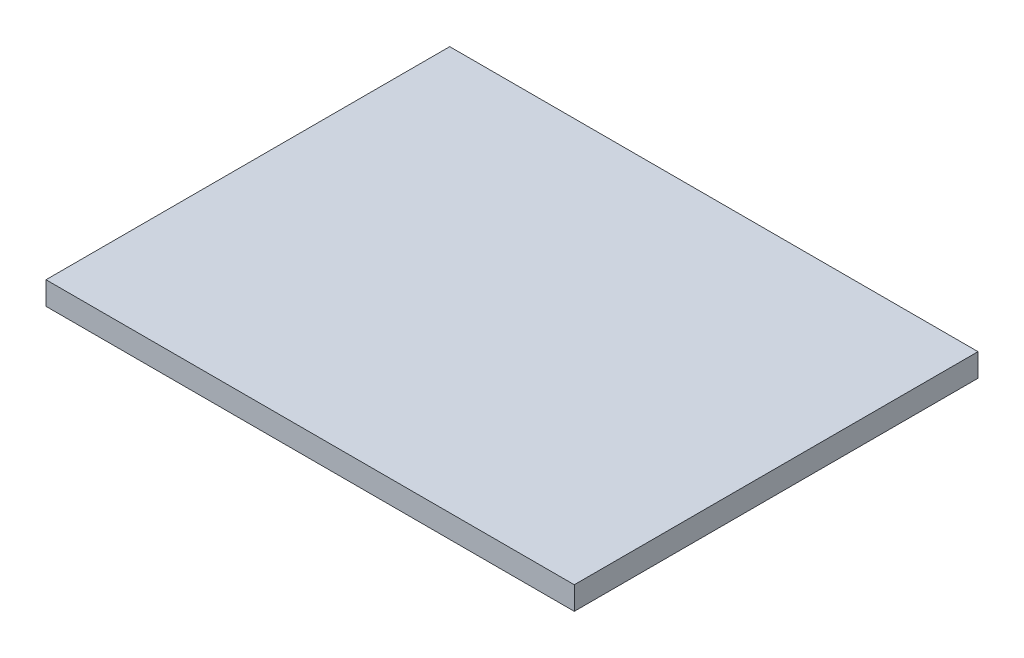
ISO-10303-21;
HEADER;
FILE_DESCRIPTION(('STEP AP214'),'2;1');
FILE_NAME('part.step','',(''),(''),'','','');
FILE_SCHEMA(('AUTOMOTIVE_DESIGN { 1 0 10303 214 1 1 1 1 }'));
ENDSEC;
DATA;
#1=APPLICATION_CONTEXT('core data for automotive mechanical design processes');
#2=APPLICATION_PROTOCOL_DEFINITION('international standard','automotive_design',2000,#1);
#3=PRODUCT_CONTEXT('',#1,'mechanical');
#4=PRODUCT('Part','Part','',(#3));
#5=PRODUCT_RELATED_PRODUCT_CATEGORY('part','',(#4));
#6=PRODUCT_DEFINITION_FORMATION('','',#4);
#7=PRODUCT_DEFINITION_CONTEXT('part definition',#1,'design');
#8=PRODUCT_DEFINITION('design','',#6,#7);
#9=PRODUCT_DEFINITION_SHAPE('','',#8);
#10=(LENGTH_UNIT() NAMED_UNIT(*) SI_UNIT(.MILLI.,.METRE.));
#11=(NAMED_UNIT(*) PLANE_ANGLE_UNIT() SI_UNIT($,.RADIAN.));
#12=(NAMED_UNIT(*) SI_UNIT($,.STERADIAN.) SOLID_ANGLE_UNIT());
#13=UNCERTAINTY_MEASURE_WITH_UNIT(LENGTH_MEASURE(1.E-05),#10,'distance_accuracy_value','');
#14=(GEOMETRIC_REPRESENTATION_CONTEXT(3) GLOBAL_UNCERTAINTY_ASSIGNED_CONTEXT((#13)) GLOBAL_UNIT_ASSIGNED_CONTEXT((#10,
#11,#12)) REPRESENTATION_CONTEXT('',''));
#15=CARTESIAN_POINT('',(0.,0.,0.));
#16=DIRECTION('',(0.,0.,1.));
#17=DIRECTION('',(1.,0.,0.));
#18=AXIS2_PLACEMENT_3D('',#15,#16,#17);
#19=CARTESIAN_POINT('',(0.,10.,0.));
#20=DIRECTION('',(1.,0.,0.));
#21=DIRECTION('',(0.,0.,-1.));
#22=AXIS2_PLACEMENT_3D('',#19,#20,#21);
#23=PLANE('',#22);
#24=DIRECTION('',(0.,0.,1.));
#25=VECTOR('',#24,1.);
#26=CARTESIAN_POINT('',(0.,0.,0.));
#27=LINE('',#26,#25);
#28=CARTESIAN_POINT('',(0.,0.,-175.));
#29=VERTEX_POINT('',#28);
#30=CARTESIAN_POINT('',(0.,0.,0.));
#31=VERTEX_POINT('',#30);
#32=EDGE_CURVE('E99',#29,#31,#27,.T.);
#33=ORIENTED_EDGE('',*,*,#32,.T.);
#34=DIRECTION('',(0.,-1.,0.));
#35=VECTOR('',#34,1.);
#36=CARTESIAN_POINT('',(0.,10.,0.));
#37=LINE('',#36,#35);
#38=CARTESIAN_POINT('',(0.,10.,0.));
#39=VERTEX_POINT('',#38);
#40=EDGE_CURVE('E11',#39,#31,#37,.T.);
#41=ORIENTED_EDGE('',*,*,#40,.F.);
#42=DIRECTION('',(0.,0.,1.));
#43=VECTOR('',#42,1.);
#44=CARTESIAN_POINT('',(0.,10.,0.));
#45=LINE('',#44,#43);
#46=CARTESIAN_POINT('',(0.,10.,-175.));
#47=VERTEX_POINT('',#46);
#48=EDGE_CURVE('E87',#47,#39,#45,.T.);
#49=ORIENTED_EDGE('',*,*,#48,.F.);
#50=DIRECTION('',(0.,-1.,0.));
#51=VECTOR('',#50,1.);
#52=CARTESIAN_POINT('',(0.,10.,-175.));
#53=LINE('',#52,#51);
#54=EDGE_CURVE('E95',#47,#29,#53,.T.);
#55=ORIENTED_EDGE('',*,*,#54,.T.);
#56=EDGE_LOOP('',(#33,#41,#49,#55));
#57=FACE_BOUND('',#56,.T.);
#58=ADVANCED_FACE('F36',(#57),#23,.F.);
#59=CARTESIAN_POINT('',(0.,10.,0.));
#60=DIRECTION('',(0.,0.,-1.));
#61=DIRECTION('',(-1.,0.,0.));
#62=AXIS2_PLACEMENT_3D('',#59,#60,#61);
#63=PLANE('',#62);
#64=DIRECTION('',(1.,0.,0.));
#65=VECTOR('',#64,1.);
#66=CARTESIAN_POINT('',(0.,0.,0.));
#67=LINE('',#66,#65);
#68=CARTESIAN_POINT('',(229.,0.,0.));
#69=VERTEX_POINT('',#68);
#70=EDGE_CURVE('E91',#31,#69,#67,.T.);
#71=ORIENTED_EDGE('',*,*,#70,.T.);
#72=DIRECTION('',(0.,-1.,0.));
#73=VECTOR('',#72,1.);
#74=CARTESIAN_POINT('',(229.,10.,0.));
#75=LINE('',#74,#73);
#76=CARTESIAN_POINT('',(229.,10.,0.));
#77=VERTEX_POINT('',#76);
#78=EDGE_CURVE('E44',#77,#69,#75,.T.);
#79=ORIENTED_EDGE('',*,*,#78,.F.);
#80=DIRECTION('',(1.,0.,0.));
#81=VECTOR('',#80,1.);
#82=CARTESIAN_POINT('',(0.,10.,0.));
#83=LINE('',#82,#81);
#84=EDGE_CURVE('E82',#39,#77,#83,.T.);
#85=ORIENTED_EDGE('',*,*,#84,.F.);
#86=ORIENTED_EDGE('',*,*,#40,.T.);
#87=EDGE_LOOP('',(#71,#79,#85,#86));
#88=FACE_BOUND('',#87,.T.);
#89=ADVANCED_FACE('F90',(#88),#63,.F.);
#90=CARTESIAN_POINT('',(229.,10.,0.));
#91=DIRECTION('',(-1.,0.,0.));
#92=DIRECTION('',(0.,0.,1.));
#93=AXIS2_PLACEMENT_3D('',#90,#91,#92);
#94=PLANE('',#93);
#95=DIRECTION('',(0.,0.,-1.));
#96=VECTOR('',#95,1.);
#97=CARTESIAN_POINT('',(229.,0.,0.));
#98=LINE('',#97,#96);
#99=CARTESIAN_POINT('',(229.,0.,-175.));
#100=VERTEX_POINT('',#99);
#101=EDGE_CURVE('E69',#69,#100,#98,.T.);
#102=ORIENTED_EDGE('',*,*,#101,.T.);
#103=DIRECTION('',(0.,-1.,0.));
#104=VECTOR('',#103,1.);
#105=CARTESIAN_POINT('',(229.,10.,-175.));
#106=LINE('',#105,#104);
#107=CARTESIAN_POINT('',(229.,10.,-175.));
#108=VERTEX_POINT('',#107);
#109=EDGE_CURVE('E92',#108,#100,#106,.T.);
#110=ORIENTED_EDGE('',*,*,#109,.F.);
#111=DIRECTION('',(0.,0.,-1.));
#112=VECTOR('',#111,1.);
#113=CARTESIAN_POINT('',(229.,10.,0.));
#114=LINE('',#113,#112);
#115=EDGE_CURVE('E85',#77,#108,#114,.T.);
#116=ORIENTED_EDGE('',*,*,#115,.F.);
#117=ORIENTED_EDGE('',*,*,#78,.T.);
#118=EDGE_LOOP('',(#102,#110,#116,#117));
#119=FACE_BOUND('',#118,.T.);
#120=ADVANCED_FACE('F93',(#119),#94,.F.);
#121=CARTESIAN_POINT('',(0.,10.,-175.));
#122=DIRECTION('',(0.,0.,1.));
#123=DIRECTION('',(1.,0.,0.));
#124=AXIS2_PLACEMENT_3D('',#121,#122,#123);
#125=PLANE('',#124);
#126=DIRECTION('',(-1.,0.,0.));
#127=VECTOR('',#126,1.);
#128=CARTESIAN_POINT('',(0.,0.,-175.));
#129=LINE('',#128,#127);
#130=EDGE_CURVE('E75',#100,#29,#129,.T.);
#131=ORIENTED_EDGE('',*,*,#130,.T.);
#132=ORIENTED_EDGE('',*,*,#54,.F.);
#133=DIRECTION('',(-1.,0.,0.));
#134=VECTOR('',#133,1.);
#135=CARTESIAN_POINT('',(0.,10.,-175.));
#136=LINE('',#135,#134);
#137=EDGE_CURVE('E52',#108,#47,#136,.T.);
#138=ORIENTED_EDGE('',*,*,#137,.F.);
#139=ORIENTED_EDGE('',*,*,#109,.T.);
#140=EDGE_LOOP('',(#131,#132,#138,#139));
#141=FACE_BOUND('',#140,.T.);
#142=ADVANCED_FACE('F106',(#141),#125,.F.);
#143=CARTESIAN_POINT('',(0.,10.,0.));
#144=DIRECTION('',(0.,-1.,0.));
#145=DIRECTION('',(0.,0.,-1.));
#146=AXIS2_PLACEMENT_3D('',#143,#144,#145);
#147=PLANE('',#146);
#148=ORIENTED_EDGE('',*,*,#48,.T.);
#149=ORIENTED_EDGE('',*,*,#84,.T.);
#150=ORIENTED_EDGE('',*,*,#115,.T.);
#151=ORIENTED_EDGE('',*,*,#137,.T.);
#152=EDGE_LOOP('',(#148,#149,#150,#151));
#153=FACE_BOUND('',#152,.T.);
#154=ADVANCED_FACE('F83',(#153),#147,.F.);
#155=CARTESIAN_POINT('',(0.,0.,0.));
#156=DIRECTION('',(0.,-1.,0.));
#157=DIRECTION('',(0.,0.,-1.));
#158=AXIS2_PLACEMENT_3D('',#155,#156,#157);
#159=PLANE('',#158);
#160=ORIENTED_EDGE('',*,*,#32,.F.);
#161=ORIENTED_EDGE('',*,*,#130,.F.);
#162=ORIENTED_EDGE('',*,*,#101,.F.);
#163=ORIENTED_EDGE('',*,*,#70,.F.);
#164=EDGE_LOOP('',(#160,#161,#162,#163));
#165=FACE_BOUND('',#164,.T.);
#166=ADVANCED_FACE('F109',(#165),#159,.T.);
#167=CLOSED_SHELL('',(#58,#89,#120,#142,#154,#166));
#168=MANIFOLD_SOLID_BREP('B2',#167);
#169=ADVANCED_BREP_SHAPE_REPRESENTATION('',(#18,#168),#14);
#170=SHAPE_DEFINITION_REPRESENTATION(#9,#169);
ENDSEC;
END-ISO-10303-21;
